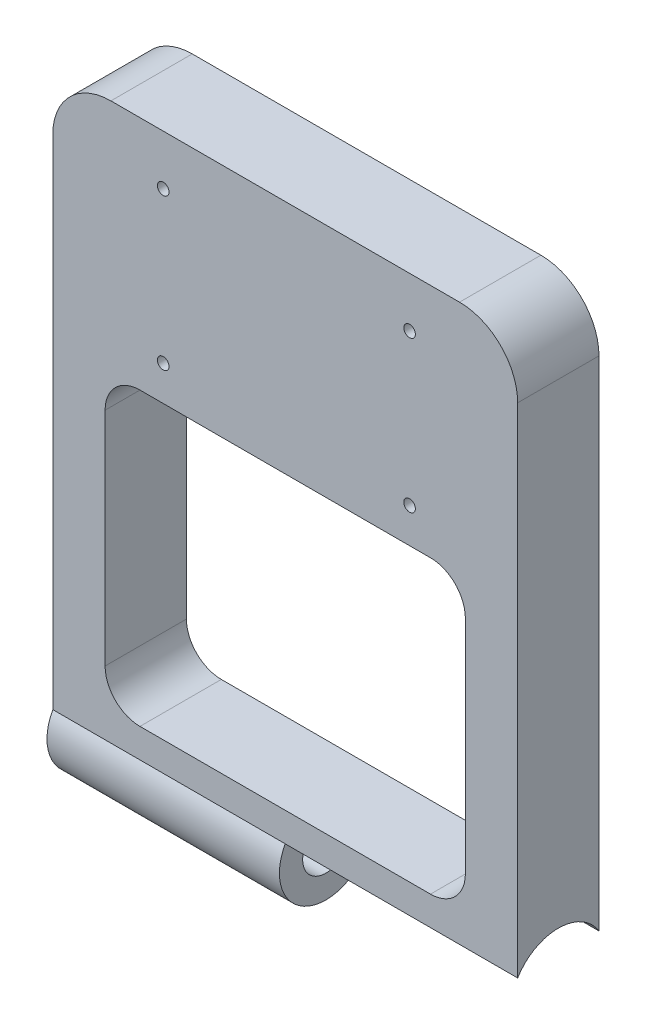
ISO-10303-21;
HEADER;
FILE_DESCRIPTION(('STEP AP214'),'2;1');
FILE_NAME('part.step','',(''),(''),'','','');
FILE_SCHEMA(('AUTOMOTIVE_DESIGN { 1 0 10303 214 1 1 1 1 }'));
ENDSEC;
DATA;
#1=APPLICATION_CONTEXT('core data for automotive mechanical design processes');
#2=APPLICATION_PROTOCOL_DEFINITION('international standard','automotive_design',2000,#1);
#3=PRODUCT_CONTEXT('',#1,'mechanical');
#4=PRODUCT('Part','Part','',(#3));
#5=PRODUCT_RELATED_PRODUCT_CATEGORY('part','',(#4));
#6=PRODUCT_DEFINITION_FORMATION('','',#4);
#7=PRODUCT_DEFINITION_CONTEXT('part definition',#1,'design');
#8=PRODUCT_DEFINITION('design','',#6,#7);
#9=PRODUCT_DEFINITION_SHAPE('','',#8);
#10=(LENGTH_UNIT() NAMED_UNIT(*) SI_UNIT(.MILLI.,.METRE.));
#11=(NAMED_UNIT(*) PLANE_ANGLE_UNIT() SI_UNIT($,.RADIAN.));
#12=(NAMED_UNIT(*) SI_UNIT($,.STERADIAN.) SOLID_ANGLE_UNIT());
#13=UNCERTAINTY_MEASURE_WITH_UNIT(LENGTH_MEASURE(1.E-05),#10,'distance_accuracy_value','');
#14=(GEOMETRIC_REPRESENTATION_CONTEXT(3) GLOBAL_UNCERTAINTY_ASSIGNED_CONTEXT((#13)) GLOBAL_UNIT_ASSIGNED_CONTEXT((#10,
#11,#12)) REPRESENTATION_CONTEXT('',''));
#15=CARTESIAN_POINT('',(0.,0.,0.));
#16=DIRECTION('',(0.,0.,1.));
#17=DIRECTION('',(1.,0.,0.));
#18=AXIS2_PLACEMENT_3D('',#15,#16,#17);
#19=CARTESIAN_POINT('',(0.,0.,7.));
#20=DIRECTION('',(0.,0.,1.));
#21=DIRECTION('',(1.,0.,0.));
#22=AXIS2_PLACEMENT_3D('',#19,#20,#21);
#23=PLANE('',#22);
#24=DIRECTION('',(0.,-1.,0.));
#25=VECTOR('',#24,1.);
#26=CARTESIAN_POINT('',(-17.7292131790813,0.,7.));
#27=LINE('',#26,#25);
#28=CARTESIAN_POINT('',(-17.7292131790813,-6.83562005277069,7.));
#29=VERTEX_POINT('',#28);
#30=CARTESIAN_POINT('',(-17.7292131790813,-25.9002044023642,7.));
#31=VERTEX_POINT('',#30);
#32=EDGE_CURVE('E234',#29,#31,#27,.T.);
#33=ORIENTED_EDGE('',*,*,#32,.F.);
#34=CARTESIAN_POINT('',(-14.7292131790813,-6.83562005277069,7.));
#35=DIRECTION('',(0.,0.,1.));
#36=DIRECTION('',(1.,0.,0.));
#37=AXIS2_PLACEMENT_3D('',#34,#35,#36);
#38=CIRCLE('',#37,3.);
#39=CARTESIAN_POINT('',(-14.7292131790813,-3.83562005277069,7.));
#40=VERTEX_POINT('',#39);
#41=EDGE_CURVE('E11',#29,#40,#38,.F.);
#42=ORIENTED_EDGE('',*,*,#41,.T.);
#43=DIRECTION('',(-1.,0.,0.));
#44=VECTOR('',#43,1.);
#45=CARTESIAN_POINT('',(0.,-3.8356200527707,7.));
#46=LINE('',#45,#44);
#47=CARTESIAN_POINT('',(10.2707868209187,-3.8356200527707,7.));
#48=VERTEX_POINT('',#47);
#49=EDGE_CURVE('E302',#48,#40,#46,.T.);
#50=ORIENTED_EDGE('',*,*,#49,.F.);
#51=CARTESIAN_POINT('',(10.2707868209187,-6.8356200527707,7.));
#52=DIRECTION('',(0.,0.,1.));
#53=DIRECTION('',(1.,0.,0.));
#54=AXIS2_PLACEMENT_3D('',#51,#52,#53);
#55=CIRCLE('',#54,3.);
#56=CARTESIAN_POINT('',(13.2707868209187,-6.8356200527707,7.));
#57=VERTEX_POINT('',#56);
#58=EDGE_CURVE('E220',#48,#57,#55,.F.);
#59=ORIENTED_EDGE('',*,*,#58,.T.);
#60=DIRECTION('',(0.,1.,0.));
#61=VECTOR('',#60,1.);
#62=CARTESIAN_POINT('',(13.2707868209187,0.,7.));
#63=LINE('',#62,#61);
#64=CARTESIAN_POINT('',(13.2707868209187,-25.9002044023642,7.));
#65=VERTEX_POINT('',#64);
#66=EDGE_CURVE('E299',#65,#57,#63,.T.);
#67=ORIENTED_EDGE('',*,*,#66,.F.);
#68=CARTESIAN_POINT('',(10.2707868209187,-25.9002044023642,7.));
#69=DIRECTION('',(0.,0.,1.));
#70=DIRECTION('',(1.,0.,0.));
#71=AXIS2_PLACEMENT_3D('',#68,#69,#70);
#72=CIRCLE('',#71,3.);
#73=CARTESIAN_POINT('',(10.2707868209187,-28.9002044023642,7.));
#74=VERTEX_POINT('',#73);
#75=EDGE_CURVE('E224',#65,#74,#72,.F.);
#76=ORIENTED_EDGE('',*,*,#75,.T.);
#77=DIRECTION('',(1.,0.,0.));
#78=VECTOR('',#77,1.);
#79=CARTESIAN_POINT('',(0.,-28.9002044023642,7.));
#80=LINE('',#79,#78);
#81=CARTESIAN_POINT('',(-14.7292131790813,-28.9002044023642,7.));
#82=VERTEX_POINT('',#81);
#83=EDGE_CURVE('E237',#82,#74,#80,.T.);
#84=ORIENTED_EDGE('',*,*,#83,.F.);
#85=CARTESIAN_POINT('',(-14.7292131790813,-25.9002044023642,7.));
#86=DIRECTION('',(0.,0.,1.));
#87=DIRECTION('',(1.,0.,0.));
#88=AXIS2_PLACEMENT_3D('',#85,#86,#87);
#89=CIRCLE('',#88,3.);
#90=EDGE_CURVE('E227',#82,#31,#89,.F.);
#91=ORIENTED_EDGE('',*,*,#90,.T.);
#92=EDGE_LOOP('',(#33,#42,#50,#59,#67,#76,#84,#91));
#93=FACE_BOUND('',#92,.T.);
#94=CARTESIAN_POINT('',(8.47078682091913,-0.835620052770698,7.));
#95=DIRECTION('',(0.,0.,1.));
#96=DIRECTION('',(1.,0.,0.));
#97=AXIS2_PLACEMENT_3D('',#94,#95,#96);
#98=CIRCLE('',#97,0.500000000000001);
#99=CARTESIAN_POINT('',(8.97078682091913,-0.835620052770698,7.));
#100=VERTEX_POINT('',#99);
#101=EDGE_CURVE('E315',#100,#100,#98,.T.);
#102=ORIENTED_EDGE('',*,*,#101,.F.);
#103=EDGE_LOOP('',(#102));
#104=FACE_BOUND('',#103,.T.);
#105=CARTESIAN_POINT('',(-12.7292131790809,-0.835620052770705,7.));
#106=DIRECTION('',(0.,0.,1.));
#107=DIRECTION('',(1.,0.,0.));
#108=AXIS2_PLACEMENT_3D('',#105,#106,#107);
#109=CIRCLE('',#108,0.500000000000001);
#110=CARTESIAN_POINT('',(-12.2292131790809,-0.835620052770705,7.));
#111=VERTEX_POINT('',#110);
#112=EDGE_CURVE('E321',#111,#111,#109,.T.);
#113=ORIENTED_EDGE('',*,*,#112,.F.);
#114=EDGE_LOOP('',(#113));
#115=FACE_BOUND('',#114,.T.);
#116=CARTESIAN_POINT('',(-12.7292131790809,12.1643799472293,7.));
#117=DIRECTION('',(0.,0.,1.));
#118=DIRECTION('',(1.,0.,0.));
#119=AXIS2_PLACEMENT_3D('',#116,#117,#118);
#120=CIRCLE('',#119,0.500000000000001);
#121=CARTESIAN_POINT('',(-12.2292131790809,12.1643799472293,7.));
#122=VERTEX_POINT('',#121);
#123=EDGE_CURVE('E327',#122,#122,#120,.T.);
#124=ORIENTED_EDGE('',*,*,#123,.F.);
#125=EDGE_LOOP('',(#124));
#126=FACE_BOUND('',#125,.T.);
#127=CARTESIAN_POINT('',(8.47078682091913,12.1643799472293,7.));
#128=DIRECTION('',(0.,0.,1.));
#129=DIRECTION('',(1.,0.,0.));
#130=AXIS2_PLACEMENT_3D('',#127,#128,#129);
#131=CIRCLE('',#130,0.500000000000001);
#132=CARTESIAN_POINT('',(8.97078682091913,12.1643799472293,7.));
#133=VERTEX_POINT('',#132);
#134=EDGE_CURVE('E333',#133,#133,#131,.T.);
#135=ORIENTED_EDGE('',*,*,#134,.F.);
#136=EDGE_LOOP('',(#135));
#137=FACE_BOUND('',#136,.T.);
#138=DIRECTION('',(-1.,0.,0.));
#139=VECTOR('',#138,1.);
#140=CARTESIAN_POINT('',(-22.2292131790813,16.4643799472296,7.));
#141=LINE('',#140,#139);
#142=CARTESIAN_POINT('',(12.7707868209187,16.4643799472296,7.));
#143=VERTEX_POINT('',#142);
#144=CARTESIAN_POINT('',(-17.2292131790813,16.4643799472296,7.));
#145=VERTEX_POINT('',#144);
#146=EDGE_CURVE('E173',#143,#145,#141,.T.);
#147=ORIENTED_EDGE('',*,*,#146,.T.);
#148=CARTESIAN_POINT('',(-17.2292131790813,11.4643799472296,7.));
#149=DIRECTION('',(0.,0.,1.));
#150=DIRECTION('',(1.,0.,0.));
#151=AXIS2_PLACEMENT_3D('',#148,#149,#150);
#152=CIRCLE('',#151,5.);
#153=CARTESIAN_POINT('',(-22.2292131790813,11.4643799472296,7.));
#154=VERTEX_POINT('',#153);
#155=EDGE_CURVE('E195',#145,#154,#152,.T.);
#156=ORIENTED_EDGE('',*,*,#155,.T.);
#157=DIRECTION('',(0.,-1.,0.));
#158=VECTOR('',#157,1.);
#159=CARTESIAN_POINT('',(-22.2292131790813,16.4643799472296,7.));
#160=LINE('',#159,#158);
#161=CARTESIAN_POINT('',(-22.2292131790813,-31.4002044023642,7.));
#162=VERTEX_POINT('',#161);
#163=EDGE_CURVE('E346',#154,#162,#160,.T.);
#164=ORIENTED_EDGE('',*,*,#163,.T.);
#165=DIRECTION('',(-1.,0.,0.));
#166=VECTOR('',#165,1.);
#167=CARTESIAN_POINT('',(-2.22921317908126,-31.4002044023642,7.));
#168=LINE('',#167,#166);
#169=CARTESIAN_POINT('',(-2.22921317908126,-31.4002044023642,7.));
#170=VERTEX_POINT('',#169);
#171=EDGE_CURVE('E150',#162,#170,#168,.F.);
#172=ORIENTED_EDGE('',*,*,#171,.T.);
#173=DIRECTION('',(1.,0.,0.));
#174=VECTOR('',#173,1.);
#175=CARTESIAN_POINT('',(-2.22921317908126,-31.4002044023642,7.));
#176=LINE('',#175,#174);
#177=CARTESIAN_POINT('',(17.7707868209187,-31.4002044023642,7.));
#178=VERTEX_POINT('',#177);
#179=EDGE_CURVE('E165',#178,#170,#176,.F.);
#180=ORIENTED_EDGE('',*,*,#179,.F.);
#181=DIRECTION('',(0.,1.,0.));
#182=VECTOR('',#181,1.);
#183=CARTESIAN_POINT('',(17.7707868209187,16.4643799472296,7.));
#184=LINE('',#183,#182);
#185=CARTESIAN_POINT('',(17.7707868209187,11.4643799472296,7.));
#186=VERTEX_POINT('',#185);
#187=EDGE_CURVE('E179',#178,#186,#184,.T.);
#188=ORIENTED_EDGE('',*,*,#187,.T.);
#189=CARTESIAN_POINT('',(12.7707868209187,11.4643799472296,7.));
#190=DIRECTION('',(0.,0.,1.));
#191=DIRECTION('',(1.,0.,0.));
#192=AXIS2_PLACEMENT_3D('',#189,#190,#191);
#193=CIRCLE('',#192,5.);
#194=EDGE_CURVE('E193',#186,#143,#193,.T.);
#195=ORIENTED_EDGE('',*,*,#194,.T.);
#196=EDGE_LOOP('',(#147,#156,#164,#172,#180,#188,#195));
#197=FACE_BOUND('',#196,.T.);
#198=ADVANCED_FACE('F32',(#93,#104,#115,#126,#137,#197),#23,.T.);
#199=CARTESIAN_POINT('',(0.,0.,0.));
#200=DIRECTION('',(0.,0.,1.));
#201=DIRECTION('',(1.,0.,0.));
#202=AXIS2_PLACEMENT_3D('',#199,#200,#201);
#203=PLANE('',#202);
#204=DIRECTION('',(1.,0.,0.));
#205=VECTOR('',#204,1.);
#206=CARTESIAN_POINT('',(-17.7292131790813,-3.83562005277069,0.));
#207=LINE('',#206,#205);
#208=CARTESIAN_POINT('',(-14.7292131790813,-3.83562005277069,0.));
#209=VERTEX_POINT('',#208);
#210=CARTESIAN_POINT('',(10.2707868209187,-3.8356200527707,0.));
#211=VERTEX_POINT('',#210);
#212=EDGE_CURVE('E406',#209,#211,#207,.T.);
#213=ORIENTED_EDGE('',*,*,#212,.F.);
#214=CARTESIAN_POINT('',(-14.7292131790813,-6.83562005277069,0.));
#215=DIRECTION('',(0.,0.,1.));
#216=DIRECTION('',(1.,0.,0.));
#217=AXIS2_PLACEMENT_3D('',#214,#215,#216);
#218=CIRCLE('',#217,3.);
#219=CARTESIAN_POINT('',(-17.7292131790813,-6.83562005277069,0.));
#220=VERTEX_POINT('',#219);
#221=EDGE_CURVE('E40',#209,#220,#218,.T.);
#222=ORIENTED_EDGE('',*,*,#221,.T.);
#223=DIRECTION('',(0.,1.,0.));
#224=VECTOR('',#223,1.);
#225=CARTESIAN_POINT('',(-17.7292131790813,-3.83562005277069,0.));
#226=LINE('',#225,#224);
#227=CARTESIAN_POINT('',(-17.7292131790813,-25.9002044023642,0.));
#228=VERTEX_POINT('',#227);
#229=EDGE_CURVE('E409',#228,#220,#226,.T.);
#230=ORIENTED_EDGE('',*,*,#229,.F.);
#231=CARTESIAN_POINT('',(-14.7292131790813,-25.9002044023642,0.));
#232=DIRECTION('',(0.,0.,1.));
#233=DIRECTION('',(1.,0.,0.));
#234=AXIS2_PLACEMENT_3D('',#231,#232,#233);
#235=CIRCLE('',#234,3.);
#236=CARTESIAN_POINT('',(-14.7292131790813,-28.9002044023642,0.));
#237=VERTEX_POINT('',#236);
#238=EDGE_CURVE('E54',#228,#237,#235,.T.);
#239=ORIENTED_EDGE('',*,*,#238,.T.);
#240=DIRECTION('',(-1.,0.,0.));
#241=VECTOR('',#240,1.);
#242=CARTESIAN_POINT('',(-17.7292131790813,-28.9002044023642,0.));
#243=LINE('',#242,#241);
#244=CARTESIAN_POINT('',(10.2707868209187,-28.9002044023642,0.));
#245=VERTEX_POINT('',#244);
#246=EDGE_CURVE('E309',#245,#237,#243,.T.);
#247=ORIENTED_EDGE('',*,*,#246,.F.);
#248=CARTESIAN_POINT('',(10.2707868209187,-25.9002044023642,0.));
#249=DIRECTION('',(0.,0.,1.));
#250=DIRECTION('',(1.,0.,0.));
#251=AXIS2_PLACEMENT_3D('',#248,#249,#250);
#252=CIRCLE('',#251,3.);
#253=CARTESIAN_POINT('',(13.2707868209187,-25.9002044023642,0.));
#254=VERTEX_POINT('',#253);
#255=EDGE_CURVE('E222',#245,#254,#252,.T.);
#256=ORIENTED_EDGE('',*,*,#255,.T.);
#257=DIRECTION('',(0.,-1.,0.));
#258=VECTOR('',#257,1.);
#259=CARTESIAN_POINT('',(13.2707868209187,-3.8356200527707,0.));
#260=LINE('',#259,#258);
#261=CARTESIAN_POINT('',(13.2707868209187,-6.8356200527707,0.));
#262=VERTEX_POINT('',#261);
#263=EDGE_CURVE('E405',#262,#254,#260,.T.);
#264=ORIENTED_EDGE('',*,*,#263,.F.);
#265=CARTESIAN_POINT('',(10.2707868209187,-6.8356200527707,0.));
#266=DIRECTION('',(0.,0.,1.));
#267=DIRECTION('',(1.,0.,0.));
#268=AXIS2_PLACEMENT_3D('',#265,#266,#267);
#269=CIRCLE('',#268,3.);
#270=EDGE_CURVE('E218',#262,#211,#269,.T.);
#271=ORIENTED_EDGE('',*,*,#270,.T.);
#272=EDGE_LOOP('',(#213,#222,#230,#239,#247,#256,#264,#271));
#273=FACE_BOUND('',#272,.T.);
#274=CARTESIAN_POINT('',(8.47078682091913,-0.835620052770698,0.));
#275=DIRECTION('',(0.,0.,-1.));
#276=DIRECTION('',(-1.,0.,0.));
#277=AXIS2_PLACEMENT_3D('',#274,#275,#276);
#278=CIRCLE('',#277,0.500000000000001);
#279=CARTESIAN_POINT('',(7.97078682091913,-0.835620052770698,0.));
#280=VERTEX_POINT('',#279);
#281=EDGE_CURVE('E241',#280,#280,#278,.T.);
#282=ORIENTED_EDGE('',*,*,#281,.F.);
#283=EDGE_LOOP('',(#282));
#284=FACE_BOUND('',#283,.T.);
#285=CARTESIAN_POINT('',(-12.7292131790809,-0.835620052770705,0.));
#286=DIRECTION('',(0.,0.,-1.));
#287=DIRECTION('',(-1.,0.,0.));
#288=AXIS2_PLACEMENT_3D('',#285,#286,#287);
#289=CIRCLE('',#288,0.500000000000001);
#290=CARTESIAN_POINT('',(-13.2292131790809,-0.835620052770705,0.));
#291=VERTEX_POINT('',#290);
#292=EDGE_CURVE('E318',#291,#291,#289,.T.);
#293=ORIENTED_EDGE('',*,*,#292,.F.);
#294=EDGE_LOOP('',(#293));
#295=FACE_BOUND('',#294,.T.);
#296=CARTESIAN_POINT('',(-12.7292131790809,12.1643799472293,0.));
#297=DIRECTION('',(0.,0.,-1.));
#298=DIRECTION('',(-1.,0.,0.));
#299=AXIS2_PLACEMENT_3D('',#296,#297,#298);
#300=CIRCLE('',#299,0.500000000000001);
#301=CARTESIAN_POINT('',(-13.2292131790809,12.1643799472293,0.));
#302=VERTEX_POINT('',#301);
#303=EDGE_CURVE('E324',#302,#302,#300,.T.);
#304=ORIENTED_EDGE('',*,*,#303,.F.);
#305=EDGE_LOOP('',(#304));
#306=FACE_BOUND('',#305,.T.);
#307=CARTESIAN_POINT('',(8.47078682091913,12.1643799472293,0.));
#308=DIRECTION('',(0.,0.,-1.));
#309=DIRECTION('',(-1.,0.,0.));
#310=AXIS2_PLACEMENT_3D('',#307,#308,#309);
#311=CIRCLE('',#310,0.500000000000001);
#312=CARTESIAN_POINT('',(7.97078682091913,12.1643799472293,0.));
#313=VERTEX_POINT('',#312);
#314=EDGE_CURVE('E330',#313,#313,#311,.T.);
#315=ORIENTED_EDGE('',*,*,#314,.F.);
#316=EDGE_LOOP('',(#315));
#317=FACE_BOUND('',#316,.T.);
#318=DIRECTION('',(0.,-1.,0.));
#319=VECTOR('',#318,1.);
#320=CARTESIAN_POINT('',(-22.2292131790813,16.4643799472296,0.));
#321=LINE('',#320,#319);
#322=CARTESIAN_POINT('',(-22.2292131790813,11.4643799472296,0.));
#323=VERTEX_POINT('',#322);
#324=CARTESIAN_POINT('',(-22.2292131790813,-31.4002044023642,0.));
#325=VERTEX_POINT('',#324);
#326=EDGE_CURVE('E345',#323,#325,#321,.T.);
#327=ORIENTED_EDGE('',*,*,#326,.F.);
#328=CARTESIAN_POINT('',(-17.2292131790813,11.4643799472296,0.));
#329=DIRECTION('',(0.,0.,1.));
#330=DIRECTION('',(1.,0.,0.));
#331=AXIS2_PLACEMENT_3D('',#328,#329,#330);
#332=CIRCLE('',#331,5.);
#333=CARTESIAN_POINT('',(-17.2292131790813,16.4643799472296,0.));
#334=VERTEX_POINT('',#333);
#335=EDGE_CURVE('E186',#323,#334,#332,.F.);
#336=ORIENTED_EDGE('',*,*,#335,.T.);
#337=DIRECTION('',(-1.,0.,0.));
#338=VECTOR('',#337,1.);
#339=CARTESIAN_POINT('',(-22.2292131790813,16.4643799472296,0.));
#340=LINE('',#339,#338);
#341=CARTESIAN_POINT('',(12.7707868209187,16.4643799472296,0.));
#342=VERTEX_POINT('',#341);
#343=EDGE_CURVE('E182',#342,#334,#340,.T.);
#344=ORIENTED_EDGE('',*,*,#343,.F.);
#345=CARTESIAN_POINT('',(12.7707868209187,11.4643799472296,0.));
#346=DIRECTION('',(0.,0.,1.));
#347=DIRECTION('',(1.,0.,0.));
#348=AXIS2_PLACEMENT_3D('',#345,#346,#347);
#349=CIRCLE('',#348,5.);
#350=CARTESIAN_POINT('',(17.7707868209187,11.4643799472296,0.));
#351=VERTEX_POINT('',#350);
#352=EDGE_CURVE('E176',#342,#351,#349,.F.);
#353=ORIENTED_EDGE('',*,*,#352,.T.);
#354=DIRECTION('',(0.,1.,0.));
#355=VECTOR('',#354,1.);
#356=CARTESIAN_POINT('',(17.7707868209187,16.4643799472296,0.));
#357=LINE('',#356,#355);
#358=CARTESIAN_POINT('',(17.7707868209187,-31.4002044023642,0.));
#359=VERTEX_POINT('',#358);
#360=EDGE_CURVE('E171',#359,#351,#357,.T.);
#361=ORIENTED_EDGE('',*,*,#360,.F.);
#362=DIRECTION('',(1.,0.,0.));
#363=VECTOR('',#362,1.);
#364=CARTESIAN_POINT('',(-2.22921317908126,-31.4002044023642,0.));
#365=LINE('',#364,#363);
#366=CARTESIAN_POINT('',(-2.22921317908126,-31.4002044023642,0.));
#367=VERTEX_POINT('',#366);
#368=EDGE_CURVE('E162',#359,#367,#365,.F.);
#369=ORIENTED_EDGE('',*,*,#368,.T.);
#370=DIRECTION('',(-1.,0.,0.));
#371=VECTOR('',#370,1.);
#372=CARTESIAN_POINT('',(-2.22921317908126,-31.4002044023642,0.));
#373=LINE('',#372,#371);
#374=EDGE_CURVE('E140',#325,#367,#373,.F.);
#375=ORIENTED_EDGE('',*,*,#374,.F.);
#376=EDGE_LOOP('',(#327,#336,#344,#353,#361,#369,#375));
#377=FACE_BOUND('',#376,.T.);
#378=ADVANCED_FACE('F169',(#273,#284,#295,#306,#317,#377),#203,.F.);
#379=CARTESIAN_POINT('',(-22.2292131790813,16.4643799472296,7.));
#380=DIRECTION('',(1.,0.,0.));
#381=DIRECTION('',(0.,1.,0.));
#382=AXIS2_PLACEMENT_3D('',#379,#380,#381);
#383=PLANE('',#382);
#384=CARTESIAN_POINT('',(-22.2292131790813,-33.3366960754679,3.5));
#385=DIRECTION('',(1.,0.,0.));
#386=DIRECTION('',(0.,1.,0.));
#387=AXIS2_PLACEMENT_3D('',#384,#385,#386);
#388=CIRCLE('',#387,2.);
#389=CARTESIAN_POINT('',(-22.2292131790813,-31.3366960754679,3.5));
#390=VERTEX_POINT('',#389);
#391=EDGE_CURVE('E336',#390,#390,#388,.T.);
#392=ORIENTED_EDGE('',*,*,#391,.T.);
#393=EDGE_LOOP('',(#392));
#394=FACE_BOUND('',#393,.T.);
#395=ORIENTED_EDGE('',*,*,#163,.F.);
#396=DIRECTION('',(0.,0.,-1.));
#397=VECTOR('',#396,1.);
#398=CARTESIAN_POINT('',(-22.2292131790813,11.4643799472296,7.));
#399=LINE('',#398,#397);
#400=EDGE_CURVE('E172',#154,#323,#399,.T.);
#401=ORIENTED_EDGE('',*,*,#400,.T.);
#402=ORIENTED_EDGE('',*,*,#326,.T.);
#403=CARTESIAN_POINT('',(-22.2292131790813,-33.3366960754679,3.5));
#404=DIRECTION('',(1.,0.,0.));
#405=DIRECTION('',(0.,1.,0.));
#406=AXIS2_PLACEMENT_3D('',#403,#404,#405);
#407=CIRCLE('',#406,4.);
#408=EDGE_CURVE('E146',#162,#325,#407,.T.);
#409=ORIENTED_EDGE('',*,*,#408,.F.);
#410=EDGE_LOOP('',(#395,#401,#402,#409));
#411=FACE_BOUND('',#410,.T.);
#412=ADVANCED_FACE('F259',(#394,#411),#383,.F.);
#413=CARTESIAN_POINT('',(17.7707868209187,16.4643799472296,7.));
#414=DIRECTION('',(-1.,0.,0.));
#415=DIRECTION('',(0.,-1.,0.));
#416=AXIS2_PLACEMENT_3D('',#413,#414,#415);
#417=PLANE('',#416);
#418=ORIENTED_EDGE('',*,*,#360,.T.);
#419=DIRECTION('',(0.,0.,-1.));
#420=VECTOR('',#419,1.);
#421=CARTESIAN_POINT('',(17.7707868209187,11.4643799472296,7.));
#422=LINE('',#421,#420);
#423=EDGE_CURVE('E197',#351,#186,#422,.F.);
#424=ORIENTED_EDGE('',*,*,#423,.T.);
#425=ORIENTED_EDGE('',*,*,#187,.F.);
#426=CARTESIAN_POINT('',(17.7707868209187,-33.5356200527704,3.5));
#427=DIRECTION('',(1.,0.,0.));
#428=DIRECTION('',(0.,1.,0.));
#429=AXIS2_PLACEMENT_3D('',#426,#427,#428);
#430=CIRCLE('',#429,4.1);
#431=EDGE_CURVE('E166',#359,#178,#430,.T.);
#432=ORIENTED_EDGE('',*,*,#431,.F.);
#433=EDGE_LOOP('',(#418,#424,#425,#432));
#434=FACE_BOUND('',#433,.T.);
#435=ADVANCED_FACE('F267',(#434),#417,.F.);
#436=CARTESIAN_POINT('',(-22.2292131790813,16.4643799472296,7.));
#437=DIRECTION('',(0.,-1.,0.));
#438=DIRECTION('',(0.,0.,-1.));
#439=AXIS2_PLACEMENT_3D('',#436,#437,#438);
#440=PLANE('',#439);
#441=ORIENTED_EDGE('',*,*,#343,.T.);
#442=DIRECTION('',(0.,0.,-1.));
#443=VECTOR('',#442,1.);
#444=CARTESIAN_POINT('',(-17.2292131790813,16.4643799472296,7.));
#445=LINE('',#444,#443);
#446=EDGE_CURVE('E191',#334,#145,#445,.F.);
#447=ORIENTED_EDGE('',*,*,#446,.T.);
#448=ORIENTED_EDGE('',*,*,#146,.F.);
#449=DIRECTION('',(0.,0.,-1.));
#450=VECTOR('',#449,1.);
#451=CARTESIAN_POINT('',(12.7707868209187,16.4643799472296,7.));
#452=LINE('',#451,#450);
#453=EDGE_CURVE('E188',#143,#342,#452,.T.);
#454=ORIENTED_EDGE('',*,*,#453,.T.);
#455=EDGE_LOOP('',(#441,#447,#448,#454));
#456=FACE_BOUND('',#455,.T.);
#457=ADVANCED_FACE('F264',(#456),#440,.F.);
#458=CARTESIAN_POINT('',(-2.22921317908126,-33.5356200527705,3.5));
#459=DIRECTION('',(1.,0.,0.));
#460=DIRECTION('',(0.,1.,0.));
#461=AXIS2_PLACEMENT_3D('',#458,#459,#460);
#462=CYLINDRICAL_SURFACE('',#461,4.1);
#463=ORIENTED_EDGE('',*,*,#179,.T.);
#464=CARTESIAN_POINT('',(-2.22921317908126,-33.5356200527705,3.5));
#465=DIRECTION('',(1.,0.,0.));
#466=DIRECTION('',(0.,1.,0.));
#467=AXIS2_PLACEMENT_3D('',#464,#465,#466);
#468=CIRCLE('',#467,4.1);
#469=EDGE_CURVE('E156',#367,#170,#468,.T.);
#470=ORIENTED_EDGE('',*,*,#469,.F.);
#471=ORIENTED_EDGE('',*,*,#368,.F.);
#472=ORIENTED_EDGE('',*,*,#431,.T.);
#473=EDGE_LOOP('',(#463,#470,#471,#472));
#474=FACE_BOUND('',#473,.T.);
#475=ADVANCED_FACE('F161',(#474),#462,.F.);
#476=CARTESIAN_POINT('',(-2.22921317908126,-33.5356200527705,3.5));
#477=DIRECTION('',(1.,0.,0.));
#478=DIRECTION('',(0.,1.,0.));
#479=AXIS2_PLACEMENT_3D('',#476,#477,#478);
#480=PLANE('',#479);
#481=CARTESIAN_POINT('',(-2.22921317908126,-33.3366960754679,3.5));
#482=DIRECTION('',(1.,0.,0.));
#483=DIRECTION('',(0.,1.,0.));
#484=AXIS2_PLACEMENT_3D('',#481,#482,#483);
#485=CIRCLE('',#484,2.);
#486=CARTESIAN_POINT('',(-2.22921317908126,-31.3366960754679,3.5));
#487=VERTEX_POINT('',#486);
#488=EDGE_CURVE('E157',#487,#487,#485,.T.);
#489=ORIENTED_EDGE('',*,*,#488,.F.);
#490=EDGE_LOOP('',(#489));
#491=FACE_BOUND('',#490,.T.);
#492=ORIENTED_EDGE('',*,*,#469,.T.);
#493=CARTESIAN_POINT('',(-2.22921317908126,-33.3366960754679,3.5));
#494=DIRECTION('',(1.,0.,0.));
#495=DIRECTION('',(0.,1.,0.));
#496=AXIS2_PLACEMENT_3D('',#493,#494,#495);
#497=CIRCLE('',#496,4.);
#498=EDGE_CURVE('E144',#170,#367,#497,.T.);
#499=ORIENTED_EDGE('',*,*,#498,.T.);
#500=EDGE_LOOP('',(#492,#499));
#501=FACE_BOUND('',#500,.T.);
#502=ADVANCED_FACE('F155',(#491,#501),#480,.T.);
#503=CARTESIAN_POINT('',(-2.22921317908126,-33.3366960754679,3.5));
#504=DIRECTION('',(-1.,0.,0.));
#505=DIRECTION('',(0.,-1.,0.));
#506=AXIS2_PLACEMENT_3D('',#503,#504,#505);
#507=CYLINDRICAL_SURFACE('',#506,2.);
#508=ORIENTED_EDGE('',*,*,#488,.T.);
#509=EDGE_LOOP('',(#508));
#510=FACE_BOUND('',#509,.T.);
#511=ORIENTED_EDGE('',*,*,#391,.F.);
#512=EDGE_LOOP('',(#511));
#513=FACE_BOUND('',#512,.T.);
#514=ADVANCED_FACE('F365',(#510,#513),#507,.F.);
#515=CARTESIAN_POINT('',(-2.22921317908126,-33.3366960754679,3.5));
#516=DIRECTION('',(-1.,0.,0.));
#517=DIRECTION('',(0.,-1.,0.));
#518=AXIS2_PLACEMENT_3D('',#515,#516,#517);
#519=CYLINDRICAL_SURFACE('',#518,4.);
#520=ORIENTED_EDGE('',*,*,#171,.F.);
#521=ORIENTED_EDGE('',*,*,#408,.T.);
#522=ORIENTED_EDGE('',*,*,#374,.T.);
#523=ORIENTED_EDGE('',*,*,#498,.F.);
#524=EDGE_LOOP('',(#520,#521,#522,#523));
#525=FACE_BOUND('',#524,.T.);
#526=ADVANCED_FACE('F143',(#525),#519,.T.);
#527=CARTESIAN_POINT('',(-17.2292131790813,11.4643799472296,7.));
#528=DIRECTION('',(0.,0.,-1.));
#529=DIRECTION('',(-1.,0.,0.));
#530=AXIS2_PLACEMENT_3D('',#527,#528,#529);
#531=CYLINDRICAL_SURFACE('',#530,5.);
#532=ORIENTED_EDGE('',*,*,#155,.F.);
#533=ORIENTED_EDGE('',*,*,#446,.F.);
#534=ORIENTED_EDGE('',*,*,#335,.F.);
#535=ORIENTED_EDGE('',*,*,#400,.F.);
#536=EDGE_LOOP('',(#532,#533,#534,#535));
#537=FACE_BOUND('',#536,.T.);
#538=ADVANCED_FACE('F275',(#537),#531,.T.);
#539=CARTESIAN_POINT('',(12.7707868209187,11.4643799472296,7.));
#540=DIRECTION('',(0.,0.,-1.));
#541=DIRECTION('',(-1.,0.,0.));
#542=AXIS2_PLACEMENT_3D('',#539,#540,#541);
#543=CYLINDRICAL_SURFACE('',#542,5.);
#544=ORIENTED_EDGE('',*,*,#194,.F.);
#545=ORIENTED_EDGE('',*,*,#423,.F.);
#546=ORIENTED_EDGE('',*,*,#352,.F.);
#547=ORIENTED_EDGE('',*,*,#453,.F.);
#548=EDGE_LOOP('',(#544,#545,#546,#547));
#549=FACE_BOUND('',#548,.T.);
#550=ADVANCED_FACE('F278',(#549),#543,.T.);
#551=CARTESIAN_POINT('',(8.47078682091913,12.1643799472293,7.5));
#552=DIRECTION('',(0.,0.,-1.));
#553=DIRECTION('',(-1.,0.,0.));
#554=AXIS2_PLACEMENT_3D('',#551,#552,#553);
#555=CYLINDRICAL_SURFACE('',#554,0.500000000000001);
#556=ORIENTED_EDGE('',*,*,#134,.T.);
#557=EDGE_LOOP('',(#556));
#558=FACE_BOUND('',#557,.T.);
#559=ORIENTED_EDGE('',*,*,#314,.T.);
#560=EDGE_LOOP('',(#559));
#561=FACE_BOUND('',#560,.T.);
#562=ADVANCED_FACE('F282',(#558,#561),#555,.F.);
#563=CARTESIAN_POINT('',(-12.7292131790809,12.1643799472293,7.5));
#564=DIRECTION('',(0.,0.,-1.));
#565=DIRECTION('',(-1.,0.,0.));
#566=AXIS2_PLACEMENT_3D('',#563,#564,#565);
#567=CYLINDRICAL_SURFACE('',#566,0.500000000000001);
#568=ORIENTED_EDGE('',*,*,#123,.T.);
#569=EDGE_LOOP('',(#568));
#570=FACE_BOUND('',#569,.T.);
#571=ORIENTED_EDGE('',*,*,#303,.T.);
#572=EDGE_LOOP('',(#571));
#573=FACE_BOUND('',#572,.T.);
#574=ADVANCED_FACE('F379',(#570,#573),#567,.F.);
#575=CARTESIAN_POINT('',(-12.7292131790809,-0.835620052770705,7.5));
#576=DIRECTION('',(0.,0.,-1.));
#577=DIRECTION('',(-1.,0.,0.));
#578=AXIS2_PLACEMENT_3D('',#575,#576,#577);
#579=CYLINDRICAL_SURFACE('',#578,0.500000000000001);
#580=ORIENTED_EDGE('',*,*,#112,.T.);
#581=EDGE_LOOP('',(#580));
#582=FACE_BOUND('',#581,.T.);
#583=ORIENTED_EDGE('',*,*,#292,.T.);
#584=EDGE_LOOP('',(#583));
#585=FACE_BOUND('',#584,.T.);
#586=ADVANCED_FACE('F383',(#582,#585),#579,.F.);
#587=CARTESIAN_POINT('',(8.47078682091913,-0.835620052770698,7.5));
#588=DIRECTION('',(0.,0.,-1.));
#589=DIRECTION('',(-1.,0.,0.));
#590=AXIS2_PLACEMENT_3D('',#587,#588,#589);
#591=CYLINDRICAL_SURFACE('',#590,0.500000000000001);
#592=ORIENTED_EDGE('',*,*,#101,.T.);
#593=EDGE_LOOP('',(#592));
#594=FACE_BOUND('',#593,.T.);
#595=ORIENTED_EDGE('',*,*,#281,.T.);
#596=EDGE_LOOP('',(#595));
#597=FACE_BOUND('',#596,.T.);
#598=ADVANCED_FACE('F387',(#594,#597),#591,.F.);
#599=CARTESIAN_POINT('',(-17.7292131790813,-3.83562005277069,7.5));
#600=DIRECTION('',(-1.,0.,0.));
#601=DIRECTION('',(0.,-1.,0.));
#602=AXIS2_PLACEMENT_3D('',#599,#600,#601);
#603=PLANE('',#602);
#604=ORIENTED_EDGE('',*,*,#32,.T.);
#605=DIRECTION('',(0.,0.,-1.));
#606=VECTOR('',#605,1.);
#607=CARTESIAN_POINT('',(-17.7292131790813,-25.9002044023642,0.));
#608=LINE('',#607,#606);
#609=EDGE_CURVE('E216',#31,#228,#608,.T.);
#610=ORIENTED_EDGE('',*,*,#609,.T.);
#611=ORIENTED_EDGE('',*,*,#229,.T.);
#612=DIRECTION('',(0.,0.,-1.));
#613=VECTOR('',#612,1.);
#614=CARTESIAN_POINT('',(-17.7292131790813,-6.83562005277069,7.));
#615=LINE('',#614,#613);
#616=EDGE_CURVE('E214',#220,#29,#615,.F.);
#617=ORIENTED_EDGE('',*,*,#616,.T.);
#618=EDGE_LOOP('',(#604,#610,#611,#617));
#619=FACE_BOUND('',#618,.T.);
#620=ADVANCED_FACE('F239',(#619),#603,.F.);
#621=CARTESIAN_POINT('',(-17.7292131790813,-28.9002044023642,7.5));
#622=DIRECTION('',(0.,-1.,0.));
#623=DIRECTION('',(1.,0.,0.));
#624=AXIS2_PLACEMENT_3D('',#621,#622,#623);
#625=PLANE('',#624);
#626=ORIENTED_EDGE('',*,*,#83,.T.);
#627=DIRECTION('',(0.,0.,-1.));
#628=VECTOR('',#627,1.);
#629=CARTESIAN_POINT('',(10.2707868209187,-28.9002044023642,0.));
#630=LINE('',#629,#628);
#631=EDGE_CURVE('E211',#74,#245,#630,.T.);
#632=ORIENTED_EDGE('',*,*,#631,.T.);
#633=ORIENTED_EDGE('',*,*,#246,.T.);
#634=DIRECTION('',(0.,0.,-1.));
#635=VECTOR('',#634,1.);
#636=CARTESIAN_POINT('',(-14.7292131790813,-28.9002044023642,7.));
#637=LINE('',#636,#635);
#638=EDGE_CURVE('E209',#237,#82,#637,.F.);
#639=ORIENTED_EDGE('',*,*,#638,.T.);
#640=EDGE_LOOP('',(#626,#632,#633,#639));
#641=FACE_BOUND('',#640,.T.);
#642=ADVANCED_FACE('F393',(#641),#625,.F.);
#643=CARTESIAN_POINT('',(13.2707868209187,-3.8356200527707,7.5));
#644=DIRECTION('',(1.,0.,0.));
#645=DIRECTION('',(0.,1.,0.));
#646=AXIS2_PLACEMENT_3D('',#643,#644,#645);
#647=PLANE('',#646);
#648=ORIENTED_EDGE('',*,*,#66,.T.);
#649=DIRECTION('',(0.,0.,-1.));
#650=VECTOR('',#649,1.);
#651=CARTESIAN_POINT('',(13.2707868209187,-6.8356200527707,0.));
#652=LINE('',#651,#650);
#653=EDGE_CURVE('E201',#57,#262,#652,.T.);
#654=ORIENTED_EDGE('',*,*,#653,.T.);
#655=ORIENTED_EDGE('',*,*,#263,.T.);
#656=DIRECTION('',(0.,0.,-1.));
#657=VECTOR('',#656,1.);
#658=CARTESIAN_POINT('',(13.2707868209187,-25.9002044023642,7.));
#659=LINE('',#658,#657);
#660=EDGE_CURVE('E199',#254,#65,#659,.F.);
#661=ORIENTED_EDGE('',*,*,#660,.T.);
#662=EDGE_LOOP('',(#648,#654,#655,#661));
#663=FACE_BOUND('',#662,.T.);
#664=ADVANCED_FACE('F290',(#663),#647,.F.);
#665=CARTESIAN_POINT('',(-17.7292131790813,-3.83562005277069,7.5));
#666=DIRECTION('',(0.,1.,0.));
#667=DIRECTION('',(-1.,0.,0.));
#668=AXIS2_PLACEMENT_3D('',#665,#666,#667);
#669=PLANE('',#668);
#670=ORIENTED_EDGE('',*,*,#212,.T.);
#671=DIRECTION('',(0.,0.,-1.));
#672=VECTOR('',#671,1.);
#673=CARTESIAN_POINT('',(10.2707868209187,-3.8356200527707,7.));
#674=LINE('',#673,#672);
#675=EDGE_CURVE('E207',#211,#48,#674,.F.);
#676=ORIENTED_EDGE('',*,*,#675,.T.);
#677=ORIENTED_EDGE('',*,*,#49,.T.);
#678=DIRECTION('',(0.,0.,-1.));
#679=VECTOR('',#678,1.);
#680=CARTESIAN_POINT('',(-14.7292131790813,-3.83562005277069,0.));
#681=LINE('',#680,#679);
#682=EDGE_CURVE('E204',#40,#209,#681,.T.);
#683=ORIENTED_EDGE('',*,*,#682,.T.);
#684=EDGE_LOOP('',(#670,#676,#677,#683));
#685=FACE_BOUND('',#684,.T.);
#686=ADVANCED_FACE('F285',(#685),#669,.F.);
#687=CARTESIAN_POINT('',(10.2707868209187,-6.8356200527707,7.5));
#688=DIRECTION('',(0.,0.,1.));
#689=DIRECTION('',(1.,0.,0.));
#690=AXIS2_PLACEMENT_3D('',#687,#688,#689);
#691=CYLINDRICAL_SURFACE('',#690,3.);
#692=ORIENTED_EDGE('',*,*,#58,.F.);
#693=ORIENTED_EDGE('',*,*,#675,.F.);
#694=ORIENTED_EDGE('',*,*,#270,.F.);
#695=ORIENTED_EDGE('',*,*,#653,.F.);
#696=EDGE_LOOP('',(#692,#693,#694,#695));
#697=FACE_BOUND('',#696,.T.);
#698=ADVANCED_FACE('F251',(#697),#691,.F.);
#699=CARTESIAN_POINT('',(10.2707868209187,-25.9002044023642,7.5));
#700=DIRECTION('',(0.,0.,1.));
#701=DIRECTION('',(1.,0.,0.));
#702=AXIS2_PLACEMENT_3D('',#699,#700,#701);
#703=CYLINDRICAL_SURFACE('',#702,3.);
#704=ORIENTED_EDGE('',*,*,#75,.F.);
#705=ORIENTED_EDGE('',*,*,#660,.F.);
#706=ORIENTED_EDGE('',*,*,#255,.F.);
#707=ORIENTED_EDGE('',*,*,#631,.F.);
#708=EDGE_LOOP('',(#704,#705,#706,#707));
#709=FACE_BOUND('',#708,.T.);
#710=ADVANCED_FACE('F245',(#709),#703,.F.);
#711=CARTESIAN_POINT('',(-14.7292131790813,-25.9002044023642,7.5));
#712=DIRECTION('',(0.,0.,1.));
#713=DIRECTION('',(1.,0.,0.));
#714=AXIS2_PLACEMENT_3D('',#711,#712,#713);
#715=CYLINDRICAL_SURFACE('',#714,3.);
#716=ORIENTED_EDGE('',*,*,#90,.F.);
#717=ORIENTED_EDGE('',*,*,#638,.F.);
#718=ORIENTED_EDGE('',*,*,#238,.F.);
#719=ORIENTED_EDGE('',*,*,#609,.F.);
#720=EDGE_LOOP('',(#716,#717,#718,#719));
#721=FACE_BOUND('',#720,.T.);
#722=ADVANCED_FACE('F243',(#721),#715,.F.);
#723=CARTESIAN_POINT('',(-14.7292131790813,-6.83562005277069,7.5));
#724=DIRECTION('',(0.,0.,1.));
#725=DIRECTION('',(1.,0.,0.));
#726=AXIS2_PLACEMENT_3D('',#723,#724,#725);
#727=CYLINDRICAL_SURFACE('',#726,3.);
#728=ORIENTED_EDGE('',*,*,#41,.F.);
#729=ORIENTED_EDGE('',*,*,#616,.F.);
#730=ORIENTED_EDGE('',*,*,#221,.F.);
#731=ORIENTED_EDGE('',*,*,#682,.F.);
#732=EDGE_LOOP('',(#728,#729,#730,#731));
#733=FACE_BOUND('',#732,.T.);
#734=ADVANCED_FACE('F34',(#733),#727,.F.);
#735=CLOSED_SHELL('',(#198,#378,#412,#435,#457,#475,#502,#514,#526,#538,#550,#562,#574,#586,
#598,#620,#642,#664,#686,#698,#710,#722,#734));
#736=MANIFOLD_SOLID_BREP('B2',#735);
#737=ADVANCED_BREP_SHAPE_REPRESENTATION('',(#18,#736),#14);
#738=SHAPE_DEFINITION_REPRESENTATION(#9,#737);
ENDSEC;
END-ISO-10303-21;
